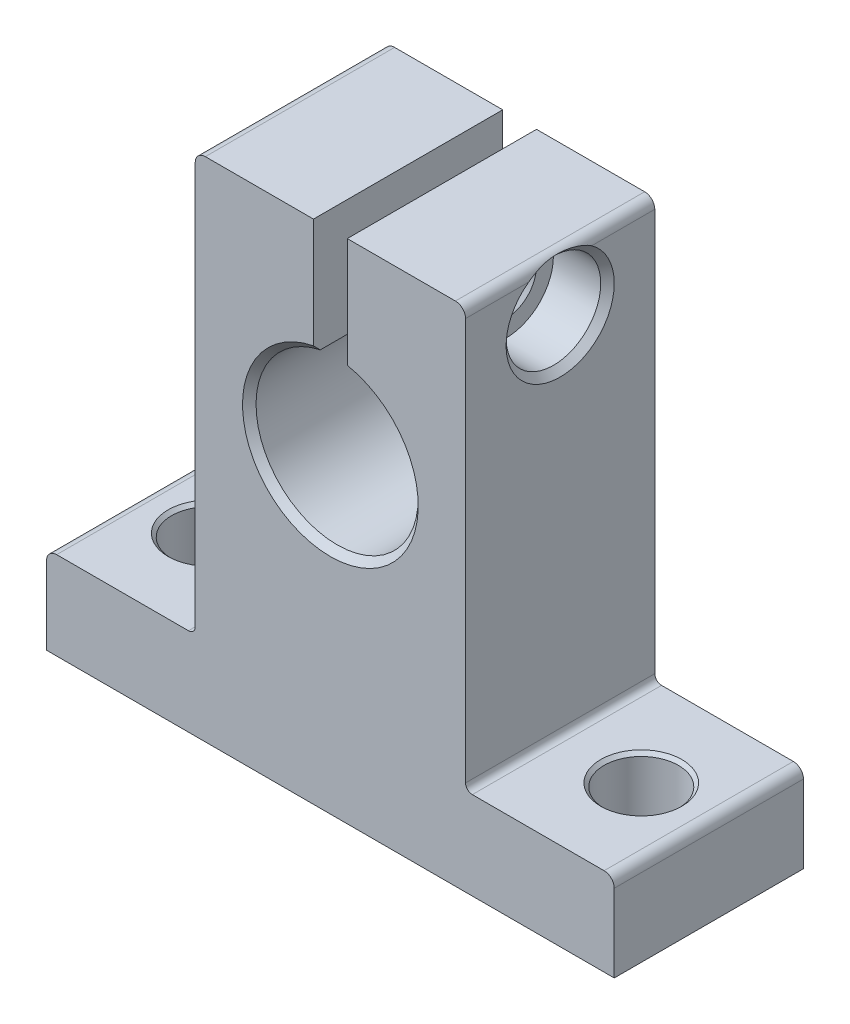
ISO-10303-21;
HEADER;
FILE_DESCRIPTION(('STEP AP214'),'2;1');
FILE_NAME('part.step','',(''),(''),'','','');
FILE_SCHEMA(('AUTOMOTIVE_DESIGN { 1 0 10303 214 1 1 1 1 }'));
ENDSEC;
DATA;
#1=APPLICATION_CONTEXT('core data for automotive mechanical design processes');
#2=APPLICATION_PROTOCOL_DEFINITION('international standard','automotive_design',2000,#1);
#3=PRODUCT_CONTEXT('',#1,'mechanical');
#4=PRODUCT('Part','Part','',(#3));
#5=PRODUCT_RELATED_PRODUCT_CATEGORY('part','',(#4));
#6=PRODUCT_DEFINITION_FORMATION('','',#4);
#7=PRODUCT_DEFINITION_CONTEXT('part definition',#1,'design');
#8=PRODUCT_DEFINITION('design','',#6,#7);
#9=PRODUCT_DEFINITION_SHAPE('','',#8);
#10=(LENGTH_UNIT() NAMED_UNIT(*) SI_UNIT(.MILLI.,.METRE.));
#11=(NAMED_UNIT(*) PLANE_ANGLE_UNIT() SI_UNIT($,.RADIAN.));
#12=(NAMED_UNIT(*) SI_UNIT($,.STERADIAN.) SOLID_ANGLE_UNIT());
#13=UNCERTAINTY_MEASURE_WITH_UNIT(LENGTH_MEASURE(1.E-05),#10,'distance_accuracy_value','');
#14=(GEOMETRIC_REPRESENTATION_CONTEXT(3) GLOBAL_UNCERTAINTY_ASSIGNED_CONTEXT((#13)) GLOBAL_UNIT_ASSIGNED_CONTEXT((#10,
#11,#12)) REPRESENTATION_CONTEXT('',''));
#15=CARTESIAN_POINT('',(0.,0.,0.));
#16=DIRECTION('',(0.,0.,1.));
#17=DIRECTION('',(1.,0.,0.));
#18=AXIS2_PLACEMENT_3D('',#15,#16,#17);
#19=CARTESIAN_POINT('',(-9.99999999999999,14.5,7.));
#20=DIRECTION('',(0.,1.,0.));
#21=DIRECTION('',(0.,0.,1.));
#22=AXIS2_PLACEMENT_3D('',#19,#20,#21);
#23=PLANE('',#22);
#24=DIRECTION('',(1.,0.,0.));
#25=VECTOR('',#24,1.);
#26=CARTESIAN_POINT('',(-9.99999999999999,14.5,-7.));
#27=LINE('',#26,#25);
#28=CARTESIAN_POINT('',(-9.24999999999999,14.5,-7.));
#29=VERTEX_POINT('',#28);
#30=CARTESIAN_POINT('',(-1.25,14.5,-7.));
#31=VERTEX_POINT('',#30);
#32=EDGE_CURVE('E437',#29,#31,#27,.T.);
#33=ORIENTED_EDGE('',*,*,#32,.F.);
#34=DIRECTION('',(0.,0.,-1.));
#35=VECTOR('',#34,1.);
#36=CARTESIAN_POINT('',(-9.24999999999999,14.5,7.));
#37=LINE('',#36,#35);
#38=CARTESIAN_POINT('',(-9.24999999999999,14.5,7.));
#39=VERTEX_POINT('',#38);
#40=EDGE_CURVE('E245',#29,#39,#37,.F.);
#41=ORIENTED_EDGE('',*,*,#40,.T.);
#42=DIRECTION('',(1.,0.,0.));
#43=VECTOR('',#42,1.);
#44=CARTESIAN_POINT('',(-9.99999999999999,14.5,7.));
#45=LINE('',#44,#43);
#46=CARTESIAN_POINT('',(-1.25,14.5,7.));
#47=VERTEX_POINT('',#46);
#48=EDGE_CURVE('E421',#39,#47,#45,.T.);
#49=ORIENTED_EDGE('',*,*,#48,.T.);
#50=DIRECTION('',(0.,0.,-1.));
#51=VECTOR('',#50,1.);
#52=CARTESIAN_POINT('',(-1.25,14.5,7.));
#53=LINE('',#52,#51);
#54=EDGE_CURVE('E426',#47,#31,#53,.T.);
#55=ORIENTED_EDGE('',*,*,#54,.T.);
#56=EDGE_LOOP('',(#33,#41,#49,#55));
#57=FACE_BOUND('',#56,.T.);
#58=ADVANCED_FACE('F41',(#57),#23,.T.);
#59=CARTESIAN_POINT('',(-9.99999999999999,14.5,7.));
#60=DIRECTION('',(1.,0.,0.));
#61=DIRECTION('',(0.,1.,0.));
#62=AXIS2_PLACEMENT_3D('',#59,#60,#61);
#63=PLANE('',#62);
#64=CARTESIAN_POINT('',(-9.99999999999999,10.5,0.));
#65=DIRECTION('',(-1.,0.,0.));
#66=DIRECTION('',(0.,0.,1.));
#67=AXIS2_PLACEMENT_3D('',#64,#65,#66);
#68=CIRCLE('',#67,1.45);
#69=CARTESIAN_POINT('',(-9.99999999999999,10.5,1.45));
#70=VERTEX_POINT('',#69);
#71=EDGE_CURVE('E539',#70,#70,#68,.T.);
#72=ORIENTED_EDGE('',*,*,#71,.F.);
#73=EDGE_LOOP('',(#72));
#74=FACE_BOUND('',#73,.T.);
#75=DIRECTION('',(0.,-1.,0.));
#76=VECTOR('',#75,1.);
#77=CARTESIAN_POINT('',(-9.99999999999999,14.5,-7.));
#78=LINE('',#77,#76);
#79=CARTESIAN_POINT('',(-9.99999999999999,13.75,-7.));
#80=VERTEX_POINT('',#79);
#81=CARTESIAN_POINT('',(-10.,-16.,-7.));
#82=VERTEX_POINT('',#81);
#83=EDGE_CURVE('E466',#80,#82,#78,.T.);
#84=ORIENTED_EDGE('',*,*,#83,.T.);
#85=DIRECTION('',(0.,0.,-1.));
#86=VECTOR('',#85,1.);
#87=CARTESIAN_POINT('',(-10.,-16.,7.));
#88=LINE('',#87,#86);
#89=CARTESIAN_POINT('',(-10.,-16.,7.));
#90=VERTEX_POINT('',#89);
#91=EDGE_CURVE('E211',#82,#90,#88,.F.);
#92=ORIENTED_EDGE('',*,*,#91,.T.);
#93=DIRECTION('',(0.,-1.,0.));
#94=VECTOR('',#93,1.);
#95=CARTESIAN_POINT('',(-9.99999999999999,14.5,7.));
#96=LINE('',#95,#94);
#97=CARTESIAN_POINT('',(-9.99999999999999,13.75,7.));
#98=VERTEX_POINT('',#97);
#99=EDGE_CURVE('E419',#98,#90,#96,.T.);
#100=ORIENTED_EDGE('',*,*,#99,.F.);
#101=DIRECTION('',(0.,0.,-1.));
#102=VECTOR('',#101,1.);
#103=CARTESIAN_POINT('',(-9.99999999999999,13.75,-7.));
#104=LINE('',#103,#102);
#105=EDGE_CURVE('E214',#98,#80,#104,.T.);
#106=ORIENTED_EDGE('',*,*,#105,.T.);
#107=EDGE_LOOP('',(#84,#92,#100,#106));
#108=FACE_BOUND('',#107,.T.);
#109=ADVANCED_FACE('F322',(#74,#108),#63,.F.);
#110=CARTESIAN_POINT('',(-21.,-16.5,7.));
#111=DIRECTION('',(0.,1.,0.));
#112=DIRECTION('',(0.,0.,1.));
#113=AXIS2_PLACEMENT_3D('',#110,#111,#112);
#114=PLANE('',#113);
#115=CARTESIAN_POINT('',(-16.,-16.5,0.));
#116=DIRECTION('',(0.,1.,0.));
#117=DIRECTION('',(0.,0.,1.));
#118=AXIS2_PLACEMENT_3D('',#115,#116,#117);
#119=CIRCLE('',#118,3.);
#120=CARTESIAN_POINT('',(-16.,-16.5,3.));
#121=VERTEX_POINT('',#120);
#122=EDGE_CURVE('E530',#121,#121,#119,.T.);
#123=ORIENTED_EDGE('',*,*,#122,.F.);
#124=EDGE_LOOP('',(#123));
#125=FACE_BOUND('',#124,.T.);
#126=DIRECTION('',(1.,0.,0.));
#127=VECTOR('',#126,1.);
#128=CARTESIAN_POINT('',(-21.,-16.5,7.));
#129=LINE('',#128,#127);
#130=CARTESIAN_POINT('',(-20.25,-16.5,7.));
#131=VERTEX_POINT('',#130);
#132=CARTESIAN_POINT('',(-10.5,-16.5,7.));
#133=VERTEX_POINT('',#132);
#134=EDGE_CURVE('E427',#131,#133,#129,.T.);
#135=ORIENTED_EDGE('',*,*,#134,.T.);
#136=DIRECTION('',(0.,0.,-1.));
#137=VECTOR('',#136,1.);
#138=CARTESIAN_POINT('',(-10.5,-16.5,7.));
#139=LINE('',#138,#137);
#140=CARTESIAN_POINT('',(-10.5,-16.5,-7.));
#141=VERTEX_POINT('',#140);
#142=EDGE_CURVE('E480',#133,#141,#139,.T.);
#143=ORIENTED_EDGE('',*,*,#142,.T.);
#144=DIRECTION('',(1.,0.,0.));
#145=VECTOR('',#144,1.);
#146=CARTESIAN_POINT('',(-21.,-16.5,-7.));
#147=LINE('',#146,#145);
#148=CARTESIAN_POINT('',(-20.25,-16.5,-7.));
#149=VERTEX_POINT('',#148);
#150=EDGE_CURVE('E463',#149,#141,#147,.T.);
#151=ORIENTED_EDGE('',*,*,#150,.F.);
#152=DIRECTION('',(0.,0.,-1.));
#153=VECTOR('',#152,1.);
#154=CARTESIAN_POINT('',(-20.25,-16.5,7.));
#155=LINE('',#154,#153);
#156=EDGE_CURVE('E470',#149,#131,#155,.F.);
#157=ORIENTED_EDGE('',*,*,#156,.T.);
#158=EDGE_LOOP('',(#135,#143,#151,#157));
#159=FACE_BOUND('',#158,.T.);
#160=ADVANCED_FACE('F325',(#125,#159),#114,.T.);
#161=CARTESIAN_POINT('',(-21.,-23.,7.));
#162=DIRECTION('',(-1.,0.,0.));
#163=DIRECTION('',(0.,-1.,0.));
#164=AXIS2_PLACEMENT_3D('',#161,#162,#163);
#165=PLANE('',#164);
#166=DIRECTION('',(0.,1.,0.));
#167=VECTOR('',#166,1.);
#168=CARTESIAN_POINT('',(-21.,-23.,7.));
#169=LINE('',#168,#167);
#170=CARTESIAN_POINT('',(-21.,-23.,7.));
#171=VERTEX_POINT('',#170);
#172=CARTESIAN_POINT('',(-21.,-17.25,7.));
#173=VERTEX_POINT('',#172);
#174=EDGE_CURVE('E433',#171,#173,#169,.T.);
#175=ORIENTED_EDGE('',*,*,#174,.T.);
#176=DIRECTION('',(0.,0.,-1.));
#177=VECTOR('',#176,1.);
#178=CARTESIAN_POINT('',(-21.,-17.25,7.));
#179=LINE('',#178,#177);
#180=CARTESIAN_POINT('',(-21.,-17.25,-7.));
#181=VERTEX_POINT('',#180);
#182=EDGE_CURVE('E225',#173,#181,#179,.T.);
#183=ORIENTED_EDGE('',*,*,#182,.T.);
#184=DIRECTION('',(0.,1.,0.));
#185=VECTOR('',#184,1.);
#186=CARTESIAN_POINT('',(-21.,-23.,-7.));
#187=LINE('',#186,#185);
#188=CARTESIAN_POINT('',(-21.,-23.,-7.));
#189=VERTEX_POINT('',#188);
#190=EDGE_CURVE('E460',#189,#181,#187,.T.);
#191=ORIENTED_EDGE('',*,*,#190,.F.);
#192=DIRECTION('',(0.,0.,-1.));
#193=VECTOR('',#192,1.);
#194=CARTESIAN_POINT('',(-21.,-23.,7.));
#195=LINE('',#194,#193);
#196=EDGE_CURVE('E468',#171,#189,#195,.T.);
#197=ORIENTED_EDGE('',*,*,#196,.F.);
#198=EDGE_LOOP('',(#175,#183,#191,#197));
#199=FACE_BOUND('',#198,.T.);
#200=ADVANCED_FACE('F329',(#199),#165,.T.);
#201=CARTESIAN_POINT('',(-21.,-23.,7.));
#202=DIRECTION('',(0.,1.,0.));
#203=DIRECTION('',(-1.,0.,0.));
#204=AXIS2_PLACEMENT_3D('',#201,#202,#203);
#205=PLANE('',#204);
#206=CARTESIAN_POINT('',(-16.,-23.,0.));
#207=DIRECTION('',(0.,1.,0.));
#208=DIRECTION('',(0.,0.,1.));
#209=AXIS2_PLACEMENT_3D('',#206,#207,#208);
#210=CIRCLE('',#209,3.);
#211=CARTESIAN_POINT('',(-16.,-23.,3.));
#212=VERTEX_POINT('',#211);
#213=EDGE_CURVE('E533',#212,#212,#210,.T.);
#214=ORIENTED_EDGE('',*,*,#213,.T.);
#215=EDGE_LOOP('',(#214));
#216=FACE_BOUND('',#215,.T.);
#217=CARTESIAN_POINT('',(16.,-23.,0.));
#218=DIRECTION('',(0.,1.,0.));
#219=DIRECTION('',(0.,0.,1.));
#220=AXIS2_PLACEMENT_3D('',#217,#218,#219);
#221=CIRCLE('',#220,3.);
#222=CARTESIAN_POINT('',(16.,-23.,3.));
#223=VERTEX_POINT('',#222);
#224=EDGE_CURVE('E521',#223,#223,#221,.T.);
#225=ORIENTED_EDGE('',*,*,#224,.T.);
#226=EDGE_LOOP('',(#225));
#227=FACE_BOUND('',#226,.T.);
#228=DIRECTION('',(1.,0.,0.));
#229=VECTOR('',#228,1.);
#230=CARTESIAN_POINT('',(-21.,-23.,-7.));
#231=LINE('',#230,#229);
#232=CARTESIAN_POINT('',(21.,-23.,-7.));
#233=VERTEX_POINT('',#232);
#234=EDGE_CURVE('E458',#189,#233,#231,.T.);
#235=ORIENTED_EDGE('',*,*,#234,.T.);
#236=DIRECTION('',(0.,0.,-1.));
#237=VECTOR('',#236,1.);
#238=CARTESIAN_POINT('',(21.,-23.,7.));
#239=LINE('',#238,#237);
#240=CARTESIAN_POINT('',(21.,-23.,7.));
#241=VERTEX_POINT('',#240);
#242=EDGE_CURVE('E471',#241,#233,#239,.T.);
#243=ORIENTED_EDGE('',*,*,#242,.F.);
#244=DIRECTION('',(1.,0.,0.));
#245=VECTOR('',#244,1.);
#246=CARTESIAN_POINT('',(-21.,-23.,7.));
#247=LINE('',#246,#245);
#248=EDGE_CURVE('E494',#171,#241,#247,.T.);
#249=ORIENTED_EDGE('',*,*,#248,.F.);
#250=ORIENTED_EDGE('',*,*,#196,.T.);
#251=EDGE_LOOP('',(#235,#243,#249,#250));
#252=FACE_BOUND('',#251,.T.);
#253=ADVANCED_FACE('F333',(#216,#227,#252),#205,.F.);
#254=CARTESIAN_POINT('',(21.,-23.,7.));
#255=DIRECTION('',(-1.,0.,0.));
#256=DIRECTION('',(0.,-1.,0.));
#257=AXIS2_PLACEMENT_3D('',#254,#255,#256);
#258=PLANE('',#257);
#259=DIRECTION('',(0.,1.,0.));
#260=VECTOR('',#259,1.);
#261=CARTESIAN_POINT('',(21.,-23.,-7.));
#262=LINE('',#261,#260);
#263=CARTESIAN_POINT('',(21.,-17.25,-7.));
#264=VERTEX_POINT('',#263);
#265=EDGE_CURVE('E455',#233,#264,#262,.T.);
#266=ORIENTED_EDGE('',*,*,#265,.T.);
#267=DIRECTION('',(0.,0.,-1.));
#268=VECTOR('',#267,1.);
#269=CARTESIAN_POINT('',(21.,-17.25,7.));
#270=LINE('',#269,#268);
#271=CARTESIAN_POINT('',(21.,-17.25,7.));
#272=VERTEX_POINT('',#271);
#273=EDGE_CURVE('E243',#264,#272,#270,.F.);
#274=ORIENTED_EDGE('',*,*,#273,.T.);
#275=DIRECTION('',(0.,1.,0.));
#276=VECTOR('',#275,1.);
#277=CARTESIAN_POINT('',(21.,-23.,7.));
#278=LINE('',#277,#276);
#279=EDGE_CURVE('E495',#241,#272,#278,.T.);
#280=ORIENTED_EDGE('',*,*,#279,.F.);
#281=ORIENTED_EDGE('',*,*,#242,.T.);
#282=EDGE_LOOP('',(#266,#274,#280,#281));
#283=FACE_BOUND('',#282,.T.);
#284=ADVANCED_FACE('F337',(#283),#258,.F.);
#285=CARTESIAN_POINT('',(10.,-16.5,7.));
#286=DIRECTION('',(0.,1.,0.));
#287=DIRECTION('',(0.,0.,1.));
#288=AXIS2_PLACEMENT_3D('',#285,#286,#287);
#289=PLANE('',#288);
#290=CARTESIAN_POINT('',(16.,-16.5,0.));
#291=DIRECTION('',(0.,1.,0.));
#292=DIRECTION('',(0.,0.,1.));
#293=AXIS2_PLACEMENT_3D('',#290,#291,#292);
#294=CIRCLE('',#293,3.);
#295=CARTESIAN_POINT('',(16.,-16.5,3.));
#296=VERTEX_POINT('',#295);
#297=EDGE_CURVE('E518',#296,#296,#294,.T.);
#298=ORIENTED_EDGE('',*,*,#297,.F.);
#299=EDGE_LOOP('',(#298));
#300=FACE_BOUND('',#299,.T.);
#301=DIRECTION('',(1.,0.,0.));
#302=VECTOR('',#301,1.);
#303=CARTESIAN_POINT('',(10.,-16.5,-7.));
#304=LINE('',#303,#302);
#305=CARTESIAN_POINT('',(10.5,-16.5,-7.));
#306=VERTEX_POINT('',#305);
#307=CARTESIAN_POINT('',(20.25,-16.5,-7.));
#308=VERTEX_POINT('',#307);
#309=EDGE_CURVE('E452',#306,#308,#304,.T.);
#310=ORIENTED_EDGE('',*,*,#309,.F.);
#311=DIRECTION('',(0.,0.,-1.));
#312=VECTOR('',#311,1.);
#313=CARTESIAN_POINT('',(10.5,-16.5,7.));
#314=LINE('',#313,#312);
#315=CARTESIAN_POINT('',(10.5,-16.5,7.));
#316=VERTEX_POINT('',#315);
#317=EDGE_CURVE('E223',#306,#316,#314,.F.);
#318=ORIENTED_EDGE('',*,*,#317,.T.);
#319=DIRECTION('',(1.,0.,0.));
#320=VECTOR('',#319,1.);
#321=CARTESIAN_POINT('',(10.,-16.5,7.));
#322=LINE('',#321,#320);
#323=CARTESIAN_POINT('',(20.25,-16.5,7.));
#324=VERTEX_POINT('',#323);
#325=EDGE_CURVE('E500',#316,#324,#322,.T.);
#326=ORIENTED_EDGE('',*,*,#325,.T.);
#327=DIRECTION('',(0.,0.,-1.));
#328=VECTOR('',#327,1.);
#329=CARTESIAN_POINT('',(20.25,-16.5,-7.));
#330=LINE('',#329,#328);
#331=EDGE_CURVE('E220',#324,#308,#330,.T.);
#332=ORIENTED_EDGE('',*,*,#331,.T.);
#333=EDGE_LOOP('',(#310,#318,#326,#332));
#334=FACE_BOUND('',#333,.T.);
#335=ADVANCED_FACE('F341',(#300,#334),#289,.T.);
#336=CARTESIAN_POINT('',(9.99999999999999,14.5,7.));
#337=DIRECTION('',(1.,0.,0.));
#338=DIRECTION('',(0.,1.,0.));
#339=AXIS2_PLACEMENT_3D('',#336,#337,#338);
#340=PLANE('',#339);
#341=CARTESIAN_POINT('',(10.,10.5,0.));
#342=DIRECTION('',(1.,0.,0.));
#343=DIRECTION('',(0.,0.,-1.));
#344=AXIS2_PLACEMENT_3D('',#341,#342,#343);
#345=CIRCLE('',#344,4.);
#346=CARTESIAN_POINT('',(10.,13.75,2.33184476327221));
#347=VERTEX_POINT('',#346);
#348=CARTESIAN_POINT('',(9.99999999999999,13.75,-2.3318447632722));
#349=VERTEX_POINT('',#348);
#350=EDGE_CURVE('E190',#347,#349,#345,.T.);
#351=ORIENTED_EDGE('',*,*,#350,.F.);
#352=DIRECTION('',(0.,0.,-1.));
#353=VECTOR('',#352,1.);
#354=CARTESIAN_POINT('',(9.99999999999999,13.75,7.));
#355=LINE('',#354,#353);
#356=CARTESIAN_POINT('',(9.99999999999999,13.75,7.));
#357=VERTEX_POINT('',#356);
#358=EDGE_CURVE('E201',#347,#357,#355,.F.);
#359=ORIENTED_EDGE('',*,*,#358,.T.);
#360=DIRECTION('',(0.,-1.,0.));
#361=VECTOR('',#360,1.);
#362=CARTESIAN_POINT('',(9.99999999999999,14.5,7.));
#363=LINE('',#362,#361);
#364=CARTESIAN_POINT('',(10.,-16.,7.));
#365=VERTEX_POINT('',#364);
#366=EDGE_CURVE('E503',#357,#365,#363,.T.);
#367=ORIENTED_EDGE('',*,*,#366,.T.);
#368=DIRECTION('',(0.,0.,-1.));
#369=VECTOR('',#368,1.);
#370=CARTESIAN_POINT('',(10.,-16.,-7.));
#371=LINE('',#370,#369);
#372=CARTESIAN_POINT('',(10.,-16.,-7.));
#373=VERTEX_POINT('',#372);
#374=EDGE_CURVE('E213',#365,#373,#371,.T.);
#375=ORIENTED_EDGE('',*,*,#374,.T.);
#376=DIRECTION('',(0.,-1.,0.));
#377=VECTOR('',#376,1.);
#378=CARTESIAN_POINT('',(9.99999999999999,14.5,-7.));
#379=LINE('',#378,#377);
#380=CARTESIAN_POINT('',(9.99999999999999,13.75,-7.));
#381=VERTEX_POINT('',#380);
#382=EDGE_CURVE('E449',#381,#373,#379,.T.);
#383=ORIENTED_EDGE('',*,*,#382,.F.);
#384=EDGE_CURVE('E204',#381,#349,#355,.F.);
#385=ORIENTED_EDGE('',*,*,#384,.T.);
#386=EDGE_LOOP('',(#351,#359,#367,#375,#383,#385));
#387=FACE_BOUND('',#386,.T.);
#388=ADVANCED_FACE('F199',(#387),#340,.T.);
#389=CARTESIAN_POINT('',(1.25,14.5,7.));
#390=DIRECTION('',(0.,1.,0.));
#391=DIRECTION('',(-1.,0.,0.));
#392=AXIS2_PLACEMENT_3D('',#389,#390,#391);
#393=PLANE('',#392);
#394=DIRECTION('',(1.,0.,0.));
#395=VECTOR('',#394,1.);
#396=CARTESIAN_POINT('',(1.25,14.5,7.));
#397=LINE('',#396,#395);
#398=CARTESIAN_POINT('',(1.25,14.5,7.));
#399=VERTEX_POINT('',#398);
#400=CARTESIAN_POINT('',(9.24999999999999,14.5,7.));
#401=VERTEX_POINT('',#400);
#402=EDGE_CURVE('E505',#399,#401,#397,.T.);
#403=ORIENTED_EDGE('',*,*,#402,.T.);
#404=DIRECTION('',(0.,0.,-1.));
#405=VECTOR('',#404,1.);
#406=CARTESIAN_POINT('',(9.24999999999999,14.5,7.));
#407=LINE('',#406,#405);
#408=CARTESIAN_POINT('',(9.24999999999999,14.5,-7.));
#409=VERTEX_POINT('',#408);
#410=EDGE_CURVE('E247',#401,#409,#407,.T.);
#411=ORIENTED_EDGE('',*,*,#410,.T.);
#412=DIRECTION('',(1.,0.,0.));
#413=VECTOR('',#412,1.);
#414=CARTESIAN_POINT('',(1.25,14.5,-7.));
#415=LINE('',#414,#413);
#416=CARTESIAN_POINT('',(1.25,14.5,-7.));
#417=VERTEX_POINT('',#416);
#418=EDGE_CURVE('E446',#417,#409,#415,.T.);
#419=ORIENTED_EDGE('',*,*,#418,.F.);
#420=DIRECTION('',(0.,0.,-1.));
#421=VECTOR('',#420,1.);
#422=CARTESIAN_POINT('',(1.25,14.5,7.));
#423=LINE('',#422,#421);
#424=EDGE_CURVE('E474',#399,#417,#423,.T.);
#425=ORIENTED_EDGE('',*,*,#424,.F.);
#426=EDGE_LOOP('',(#403,#411,#419,#425));
#427=FACE_BOUND('',#426,.T.);
#428=ADVANCED_FACE('F348',(#427),#393,.T.);
#429=CARTESIAN_POINT('',(1.25,14.5,7.));
#430=DIRECTION('',(1.,0.,0.));
#431=DIRECTION('',(0.,1.,0.));
#432=AXIS2_PLACEMENT_3D('',#429,#430,#431);
#433=PLANE('',#432);
#434=CARTESIAN_POINT('',(1.25,10.5,0.));
#435=DIRECTION('',(1.,0.,0.));
#436=DIRECTION('',(0.,1.,0.));
#437=AXIS2_PLACEMENT_3D('',#434,#435,#436);
#438=CIRCLE('',#437,2.);
#439=CARTESIAN_POINT('',(1.25,12.5,0.));
#440=VERTEX_POINT('',#439);
#441=EDGE_CURVE('E542',#440,#440,#438,.T.);
#442=ORIENTED_EDGE('',*,*,#441,.T.);
#443=EDGE_LOOP('',(#442));
#444=FACE_BOUND('',#443,.T.);
#445=DIRECTION('',(0.,-1.,0.));
#446=VECTOR('',#445,1.);
#447=CARTESIAN_POINT('',(1.25,14.5,-7.));
#448=LINE('',#447,#446);
#449=CARTESIAN_POINT('',(1.25,6.37867541108654,-7.));
#450=VERTEX_POINT('',#449);
#451=EDGE_CURVE('E443',#417,#450,#448,.T.);
#452=ORIENTED_EDGE('',*,*,#451,.T.);
#453=CARTESIAN_POINT('',(1.25,6.37867541108654,-7.));
#454=CARTESIAN_POINT('',(1.25,6.29369027673478,-6.91659567988044));
#455=CARTESIAN_POINT('',(1.25,6.20867036702757,-6.83322685344399));
#456=CARTESIAN_POINT('',(1.25,6.03856099571727,-6.66656018677634));
#457=CARTESIAN_POINT('',(1.25,5.95347153411322,-6.58326234654612));
#458=CARTESIAN_POINT('',(1.25,5.86834729715275,-6.5));
#459=B_SPLINE_CURVE_WITH_KNOTS('',3,(#453,#454,#455,#456,#457,#458),.UNSPECIFIED.,.F.,.F.,(4,2,
4),(0.,0.357223622416151,0.714447249809102),.UNSPECIFIED.);
#460=CARTESIAN_POINT('',(1.25,5.86834729715275,-6.5));
#461=VERTEX_POINT('',#460);
#462=EDGE_CURVE('E365',#450,#461,#459,.T.);
#463=ORIENTED_EDGE('',*,*,#462,.T.);
#464=DIRECTION('',(0.,0.,-1.));
#465=VECTOR('',#464,1.);
#466=CARTESIAN_POINT('',(1.25,5.86834729715275,7.));
#467=LINE('',#466,#465);
#468=CARTESIAN_POINT('',(1.25,5.86834729715275,6.5));
#469=VERTEX_POINT('',#468);
#470=EDGE_CURVE('E476',#469,#461,#467,.T.);
#471=ORIENTED_EDGE('',*,*,#470,.F.);
#472=CARTESIAN_POINT('',(1.25,5.86834729715275,6.5));
#473=CARTESIAN_POINT('',(1.25,5.95347153411322,6.58326234654612));
#474=CARTESIAN_POINT('',(1.25,6.03856099571727,6.66656018677634));
#475=CARTESIAN_POINT('',(1.25,6.20867036702756,6.83322685344399));
#476=CARTESIAN_POINT('',(1.25,6.29369027673477,6.91659567988044));
#477=CARTESIAN_POINT('',(1.25,6.37867541108653,7.));
#478=B_SPLINE_CURVE_WITH_KNOTS('',3,(#472,#473,#474,#475,#476,#477),.UNSPECIFIED.,.F.,.F.,(4,2,
4),(0.,0.357223627392948,0.714447249809097),.UNSPECIFIED.);
#479=CARTESIAN_POINT('',(1.25,6.37867541108654,7.));
#480=VERTEX_POINT('',#479);
#481=EDGE_CURVE('E360',#469,#480,#478,.T.);
#482=ORIENTED_EDGE('',*,*,#481,.T.);
#483=DIRECTION('',(0.,-1.,0.));
#484=VECTOR('',#483,1.);
#485=CARTESIAN_POINT('',(1.25,14.5,7.));
#486=LINE('',#485,#484);
#487=EDGE_CURVE('E508',#399,#480,#486,.T.);
#488=ORIENTED_EDGE('',*,*,#487,.F.);
#489=ORIENTED_EDGE('',*,*,#424,.T.);
#490=EDGE_LOOP('',(#452,#463,#471,#482,#488,#489));
#491=FACE_BOUND('',#490,.T.);
#492=ADVANCED_FACE('F351',(#444,#491),#433,.F.);
#493=CARTESIAN_POINT('',(0.,0.,7.));
#494=DIRECTION('',(0.,0.,-1.));
#495=DIRECTION('',(-1.,0.,0.));
#496=AXIS2_PLACEMENT_3D('',#493,#494,#495);
#497=CYLINDRICAL_SURFACE('',#496,6.);
#498=ORIENTED_EDGE('',*,*,#470,.T.);
#499=CARTESIAN_POINT('',(0.,0.,-6.5));
#500=DIRECTION('',(0.,0.,1.));
#501=DIRECTION('',(1.,0.,0.));
#502=AXIS2_PLACEMENT_3D('',#499,#500,#501);
#503=CIRCLE('',#502,6.);
#504=CARTESIAN_POINT('',(-1.25,5.86834729715275,-6.5));
#505=VERTEX_POINT('',#504);
#506=EDGE_CURVE('E63',#461,#505,#503,.F.);
#507=ORIENTED_EDGE('',*,*,#506,.T.);
#508=DIRECTION('',(0.,0.,-1.));
#509=VECTOR('',#508,1.);
#510=CARTESIAN_POINT('',(-1.25,5.86834729715275,7.));
#511=LINE('',#510,#509);
#512=CARTESIAN_POINT('',(-1.25,5.86834729715275,6.5));
#513=VERTEX_POINT('',#512);
#514=EDGE_CURVE('E430',#513,#505,#511,.T.);
#515=ORIENTED_EDGE('',*,*,#514,.F.);
#516=CARTESIAN_POINT('',(0.,0.,6.5));
#517=DIRECTION('',(0.,0.,1.));
#518=DIRECTION('',(1.,0.,0.));
#519=AXIS2_PLACEMENT_3D('',#516,#517,#518);
#520=CIRCLE('',#519,6.);
#521=EDGE_CURVE('E370',#513,#469,#520,.T.);
#522=ORIENTED_EDGE('',*,*,#521,.T.);
#523=EDGE_LOOP('',(#498,#507,#515,#522));
#524=FACE_BOUND('',#523,.T.);
#525=ADVANCED_FACE('F356',(#524),#497,.F.);
#526=CARTESIAN_POINT('',(-1.25,14.5,7.));
#527=DIRECTION('',(1.,0.,0.));
#528=DIRECTION('',(0.,1.,0.));
#529=AXIS2_PLACEMENT_3D('',#526,#527,#528);
#530=PLANE('',#529);
#531=CARTESIAN_POINT('',(-1.25,10.5,0.));
#532=DIRECTION('',(1.,0.,0.));
#533=DIRECTION('',(0.,1.,0.));
#534=AXIS2_PLACEMENT_3D('',#531,#532,#533);
#535=CIRCLE('',#534,1.45);
#536=CARTESIAN_POINT('',(-1.25,11.95,0.));
#537=VERTEX_POINT('',#536);
#538=EDGE_CURVE('E536',#537,#537,#535,.T.);
#539=ORIENTED_EDGE('',*,*,#538,.F.);
#540=EDGE_LOOP('',(#539));
#541=FACE_BOUND('',#540,.T.);
#542=ORIENTED_EDGE('',*,*,#514,.T.);
#543=CARTESIAN_POINT('',(-1.25,5.86834729715275,-6.5));
#544=CARTESIAN_POINT('',(-1.25,5.95347153411322,-6.58326234654612));
#545=CARTESIAN_POINT('',(-1.25,6.03856099571727,-6.66656018677634));
#546=CARTESIAN_POINT('',(-1.25,6.20867036702757,-6.83322685344399));
#547=CARTESIAN_POINT('',(-1.25,6.29369027673478,-6.91659567988044));
#548=CARTESIAN_POINT('',(-1.25,6.37867541108654,-7.));
#549=B_SPLINE_CURVE_WITH_KNOTS('',3,(#543,#544,#545,#546,#547,#548),.UNSPECIFIED.,.F.,.F.,(4,2,
4),(0.,0.357223627392951,0.714447249809102),.UNSPECIFIED.);
#550=CARTESIAN_POINT('',(-1.25,6.37867541108654,-7.));
#551=VERTEX_POINT('',#550);
#552=EDGE_CURVE('E50',#505,#551,#549,.T.);
#553=ORIENTED_EDGE('',*,*,#552,.T.);
#554=DIRECTION('',(0.,-1.,0.));
#555=VECTOR('',#554,1.);
#556=CARTESIAN_POINT('',(-1.25,14.5,-7.));
#557=LINE('',#556,#555);
#558=EDGE_CURVE('E439',#31,#551,#557,.T.);
#559=ORIENTED_EDGE('',*,*,#558,.F.);
#560=ORIENTED_EDGE('',*,*,#54,.F.);
#561=DIRECTION('',(0.,-1.,0.));
#562=VECTOR('',#561,1.);
#563=CARTESIAN_POINT('',(-1.25,14.5,7.));
#564=LINE('',#563,#562);
#565=CARTESIAN_POINT('',(-1.25,6.37867541108654,7.));
#566=VERTEX_POINT('',#565);
#567=EDGE_CURVE('E510',#47,#566,#564,.T.);
#568=ORIENTED_EDGE('',*,*,#567,.T.);
#569=CARTESIAN_POINT('',(-1.25,6.37867541108654,7.));
#570=CARTESIAN_POINT('',(-1.25,6.29369027673477,6.91659567988044));
#571=CARTESIAN_POINT('',(-1.25,6.20867036702756,6.83322685344399));
#572=CARTESIAN_POINT('',(-1.25,6.03856099571727,6.66656018677634));
#573=CARTESIAN_POINT('',(-1.25,5.95347153411322,6.58326234654612));
#574=CARTESIAN_POINT('',(-1.25,5.86834729715275,6.5));
#575=B_SPLINE_CURVE_WITH_KNOTS('',3,(#569,#570,#571,#572,#573,#574),.UNSPECIFIED.,.F.,.F.,(4,2,
4),(0.,0.357223622416148,0.714447249809096),.UNSPECIFIED.);
#576=EDGE_CURVE('E380',#566,#513,#575,.T.);
#577=ORIENTED_EDGE('',*,*,#576,.T.);
#578=EDGE_LOOP('',(#542,#553,#559,#560,#568,#577));
#579=FACE_BOUND('',#578,.T.);
#580=ADVANCED_FACE('F318',(#541,#579),#530,.T.);
#581=CARTESIAN_POINT('',(0.,0.,7.));
#582=DIRECTION('',(0.,0.,1.));
#583=DIRECTION('',(1.,0.,0.));
#584=AXIS2_PLACEMENT_3D('',#581,#582,#583);
#585=PLANE('',#584);
#586=ORIENTED_EDGE('',*,*,#487,.T.);
#587=CARTESIAN_POINT('',(0.,0.,7.));
#588=DIRECTION('',(0.,0.,1.));
#589=DIRECTION('',(1.,0.,0.));
#590=AXIS2_PLACEMENT_3D('',#587,#588,#589);
#591=CIRCLE('',#590,6.5);
#592=EDGE_CURVE('E12',#480,#566,#591,.F.);
#593=ORIENTED_EDGE('',*,*,#592,.T.);
#594=ORIENTED_EDGE('',*,*,#567,.F.);
#595=ORIENTED_EDGE('',*,*,#48,.F.);
#596=CARTESIAN_POINT('',(-9.24999999999999,13.75,7.));
#597=DIRECTION('',(0.,0.,1.));
#598=DIRECTION('',(1.,0.,0.));
#599=AXIS2_PLACEMENT_3D('',#596,#597,#598);
#600=CIRCLE('',#599,0.75);
#601=EDGE_CURVE('E237',#39,#98,#600,.T.);
#602=ORIENTED_EDGE('',*,*,#601,.T.);
#603=ORIENTED_EDGE('',*,*,#99,.T.);
#604=CARTESIAN_POINT('',(-10.5,-16.,7.));
#605=DIRECTION('',(0.,0.,1.));
#606=DIRECTION('',(1.,0.,0.));
#607=AXIS2_PLACEMENT_3D('',#604,#605,#606);
#608=CIRCLE('',#607,0.5);
#609=EDGE_CURVE('E252',#90,#133,#608,.F.);
#610=ORIENTED_EDGE('',*,*,#609,.T.);
#611=ORIENTED_EDGE('',*,*,#134,.F.);
#612=CARTESIAN_POINT('',(-20.25,-17.25,7.));
#613=DIRECTION('',(0.,0.,1.));
#614=DIRECTION('',(1.,0.,0.));
#615=AXIS2_PLACEMENT_3D('',#612,#613,#614);
#616=CIRCLE('',#615,0.75);
#617=EDGE_CURVE('E241',#131,#173,#616,.T.);
#618=ORIENTED_EDGE('',*,*,#617,.T.);
#619=ORIENTED_EDGE('',*,*,#174,.F.);
#620=ORIENTED_EDGE('',*,*,#248,.T.);
#621=ORIENTED_EDGE('',*,*,#279,.T.);
#622=CARTESIAN_POINT('',(20.25,-17.25,7.));
#623=DIRECTION('',(0.,0.,1.));
#624=DIRECTION('',(1.,0.,0.));
#625=AXIS2_PLACEMENT_3D('',#622,#623,#624);
#626=CIRCLE('',#625,0.75);
#627=EDGE_CURVE('E239',#272,#324,#626,.T.);
#628=ORIENTED_EDGE('',*,*,#627,.T.);
#629=ORIENTED_EDGE('',*,*,#325,.F.);
#630=CARTESIAN_POINT('',(10.5,-16.,7.));
#631=DIRECTION('',(0.,0.,1.));
#632=DIRECTION('',(1.,0.,0.));
#633=AXIS2_PLACEMENT_3D('',#630,#631,#632);
#634=CIRCLE('',#633,0.5);
#635=EDGE_CURVE('E196',#316,#365,#634,.F.);
#636=ORIENTED_EDGE('',*,*,#635,.T.);
#637=ORIENTED_EDGE('',*,*,#366,.F.);
#638=CARTESIAN_POINT('',(9.24999999999999,13.75,7.));
#639=DIRECTION('',(0.,0.,1.));
#640=DIRECTION('',(1.,0.,0.));
#641=AXIS2_PLACEMENT_3D('',#638,#639,#640);
#642=CIRCLE('',#641,0.75);
#643=EDGE_CURVE('E210',#357,#401,#642,.T.);
#644=ORIENTED_EDGE('',*,*,#643,.T.);
#645=ORIENTED_EDGE('',*,*,#402,.F.);
#646=EDGE_LOOP('',(#586,#593,#594,#595,#602,#603,#610,#611,#618,#619,#620,#621,#628,#629,#636,
#637,#644,#645));
#647=FACE_BOUND('',#646,.T.);
#648=ADVANCED_FACE('F315',(#647),#585,.T.);
#649=CARTESIAN_POINT('',(0.,0.,-7.));
#650=DIRECTION('',(0.,0.,1.));
#651=DIRECTION('',(1.,0.,0.));
#652=AXIS2_PLACEMENT_3D('',#649,#650,#651);
#653=PLANE('',#652);
#654=ORIENTED_EDGE('',*,*,#558,.T.);
#655=CARTESIAN_POINT('',(0.,0.,-7.));
#656=DIRECTION('',(0.,0.,1.));
#657=DIRECTION('',(1.,0.,0.));
#658=AXIS2_PLACEMENT_3D('',#655,#656,#657);
#659=CIRCLE('',#658,6.50000000000001);
#660=EDGE_CURVE('E195',#551,#450,#659,.T.);
#661=ORIENTED_EDGE('',*,*,#660,.T.);
#662=ORIENTED_EDGE('',*,*,#451,.F.);
#663=ORIENTED_EDGE('',*,*,#418,.T.);
#664=CARTESIAN_POINT('',(9.24999999999999,13.75,-7.));
#665=DIRECTION('',(0.,0.,1.));
#666=DIRECTION('',(1.,0.,0.));
#667=AXIS2_PLACEMENT_3D('',#664,#665,#666);
#668=CIRCLE('',#667,0.75);
#669=EDGE_CURVE('E228',#409,#381,#668,.F.);
#670=ORIENTED_EDGE('',*,*,#669,.T.);
#671=ORIENTED_EDGE('',*,*,#382,.T.);
#672=CARTESIAN_POINT('',(10.5,-16.,-7.));
#673=DIRECTION('',(0.,0.,1.));
#674=DIRECTION('',(1.,0.,0.));
#675=AXIS2_PLACEMENT_3D('',#672,#673,#674);
#676=CIRCLE('',#675,0.5);
#677=EDGE_CURVE('E254',#373,#306,#676,.T.);
#678=ORIENTED_EDGE('',*,*,#677,.T.);
#679=ORIENTED_EDGE('',*,*,#309,.T.);
#680=CARTESIAN_POINT('',(20.25,-17.25,-7.));
#681=DIRECTION('',(0.,0.,1.));
#682=DIRECTION('',(1.,0.,0.));
#683=AXIS2_PLACEMENT_3D('',#680,#681,#682);
#684=CIRCLE('',#683,0.75);
#685=EDGE_CURVE('E232',#308,#264,#684,.F.);
#686=ORIENTED_EDGE('',*,*,#685,.T.);
#687=ORIENTED_EDGE('',*,*,#265,.F.);
#688=ORIENTED_EDGE('',*,*,#234,.F.);
#689=ORIENTED_EDGE('',*,*,#190,.T.);
#690=CARTESIAN_POINT('',(-20.25,-17.25,-7.));
#691=DIRECTION('',(0.,0.,1.));
#692=DIRECTION('',(1.,0.,0.));
#693=AXIS2_PLACEMENT_3D('',#690,#691,#692);
#694=CIRCLE('',#693,0.75);
#695=EDGE_CURVE('E234',#181,#149,#694,.F.);
#696=ORIENTED_EDGE('',*,*,#695,.T.);
#697=ORIENTED_EDGE('',*,*,#150,.T.);
#698=CARTESIAN_POINT('',(-10.5,-16.,-7.));
#699=DIRECTION('',(0.,0.,1.));
#700=DIRECTION('',(1.,0.,0.));
#701=AXIS2_PLACEMENT_3D('',#698,#699,#700);
#702=CIRCLE('',#701,0.5);
#703=EDGE_CURVE('E250',#141,#82,#702,.T.);
#704=ORIENTED_EDGE('',*,*,#703,.T.);
#705=ORIENTED_EDGE('',*,*,#83,.F.);
#706=CARTESIAN_POINT('',(-9.24999999999999,13.75,-7.));
#707=DIRECTION('',(0.,0.,1.));
#708=DIRECTION('',(1.,0.,0.));
#709=AXIS2_PLACEMENT_3D('',#706,#707,#708);
#710=CIRCLE('',#709,0.75);
#711=EDGE_CURVE('E230',#80,#29,#710,.F.);
#712=ORIENTED_EDGE('',*,*,#711,.T.);
#713=ORIENTED_EDGE('',*,*,#32,.T.);
#714=EDGE_LOOP('',(#654,#661,#662,#663,#670,#671,#678,#679,#686,#687,#688,#689,#696,#697,#704,
#705,#712,#713));
#715=FACE_BOUND('',#714,.T.);
#716=ADVANCED_FACE('F313',(#715),#653,.F.);
#717=CARTESIAN_POINT('',(16.,-22.75,0.));
#718=DIRECTION('',(0.,-1.,0.));
#719=DIRECTION('',(0.,0.,-1.));
#720=AXIS2_PLACEMENT_3D('',#717,#718,#719);
#721=CONICAL_SURFACE('',#720,2.75,0.785398163397442);
#722=ORIENTED_EDGE('',*,*,#224,.F.);
#723=EDGE_LOOP('',(#722));
#724=FACE_BOUND('',#723,.T.);
#725=CARTESIAN_POINT('',(16.,-22.75,0.));
#726=DIRECTION('',(0.,1.,0.));
#727=DIRECTION('',(0.,0.,1.));
#728=AXIS2_PLACEMENT_3D('',#725,#726,#727);
#729=CIRCLE('',#728,2.75);
#730=CARTESIAN_POINT('',(16.,-22.75,2.75));
#731=VERTEX_POINT('',#730);
#732=EDGE_CURVE('E440',#731,#731,#729,.T.);
#733=ORIENTED_EDGE('',*,*,#732,.T.);
#734=EDGE_LOOP('',(#733));
#735=FACE_BOUND('',#734,.T.);
#736=ADVANCED_FACE('F309',(#724,#735),#721,.F.);
#737=CARTESIAN_POINT('',(16.,-16.5,0.));
#738=DIRECTION('',(0.,1.,0.));
#739=DIRECTION('',(0.,0.,1.));
#740=AXIS2_PLACEMENT_3D('',#737,#738,#739);
#741=CYLINDRICAL_SURFACE('',#740,2.75);
#742=ORIENTED_EDGE('',*,*,#732,.F.);
#743=EDGE_LOOP('',(#742));
#744=FACE_BOUND('',#743,.T.);
#745=CARTESIAN_POINT('',(16.,-16.75,0.));
#746=DIRECTION('',(0.,1.,0.));
#747=DIRECTION('',(0.,0.,1.));
#748=AXIS2_PLACEMENT_3D('',#745,#746,#747);
#749=CIRCLE('',#748,2.75);
#750=CARTESIAN_POINT('',(16.,-16.75,2.75));
#751=VERTEX_POINT('',#750);
#752=EDGE_CURVE('E515',#751,#751,#749,.T.);
#753=ORIENTED_EDGE('',*,*,#752,.T.);
#754=EDGE_LOOP('',(#753));
#755=FACE_BOUND('',#754,.T.);
#756=ADVANCED_FACE('F305',(#744,#755),#741,.F.);
#757=CARTESIAN_POINT('',(16.,-16.5,0.));
#758=DIRECTION('',(0.,1.,0.));
#759=DIRECTION('',(0.,0.,1.));
#760=AXIS2_PLACEMENT_3D('',#757,#758,#759);
#761=CONICAL_SURFACE('',#760,3.,0.785398163397448);
#762=ORIENTED_EDGE('',*,*,#752,.F.);
#763=EDGE_LOOP('',(#762));
#764=FACE_BOUND('',#763,.T.);
#765=ORIENTED_EDGE('',*,*,#297,.T.);
#766=EDGE_LOOP('',(#765));
#767=FACE_BOUND('',#766,.T.);
#768=ADVANCED_FACE('F301',(#764,#767),#761,.F.);
#769=CARTESIAN_POINT('',(-16.,-22.75,0.));
#770=DIRECTION('',(0.,-1.,0.));
#771=DIRECTION('',(0.,0.,-1.));
#772=AXIS2_PLACEMENT_3D('',#769,#770,#771);
#773=CONICAL_SURFACE('',#772,2.75,0.785398163397442);
#774=ORIENTED_EDGE('',*,*,#213,.F.);
#775=EDGE_LOOP('',(#774));
#776=FACE_BOUND('',#775,.T.);
#777=CARTESIAN_POINT('',(-16.,-22.75,0.));
#778=DIRECTION('',(0.,1.,0.));
#779=DIRECTION('',(0.,0.,1.));
#780=AXIS2_PLACEMENT_3D('',#777,#778,#779);
#781=CIRCLE('',#780,2.75);
#782=CARTESIAN_POINT('',(-16.,-22.75,2.75));
#783=VERTEX_POINT('',#782);
#784=EDGE_CURVE('E524',#783,#783,#781,.T.);
#785=ORIENTED_EDGE('',*,*,#784,.T.);
#786=EDGE_LOOP('',(#785));
#787=FACE_BOUND('',#786,.T.);
#788=ADVANCED_FACE('F297',(#776,#787),#773,.F.);
#789=CARTESIAN_POINT('',(-16.,-16.5,0.));
#790=DIRECTION('',(0.,1.,0.));
#791=DIRECTION('',(0.,0.,1.));
#792=AXIS2_PLACEMENT_3D('',#789,#790,#791);
#793=CYLINDRICAL_SURFACE('',#792,2.75);
#794=ORIENTED_EDGE('',*,*,#784,.F.);
#795=EDGE_LOOP('',(#794));
#796=FACE_BOUND('',#795,.T.);
#797=CARTESIAN_POINT('',(-16.,-16.75,0.));
#798=DIRECTION('',(0.,1.,0.));
#799=DIRECTION('',(0.,0.,1.));
#800=AXIS2_PLACEMENT_3D('',#797,#798,#799);
#801=CIRCLE('',#800,2.75);
#802=CARTESIAN_POINT('',(-16.,-16.75,2.75));
#803=VERTEX_POINT('',#802);
#804=EDGE_CURVE('E527',#803,#803,#801,.T.);
#805=ORIENTED_EDGE('',*,*,#804,.T.);
#806=EDGE_LOOP('',(#805));
#807=FACE_BOUND('',#806,.T.);
#808=ADVANCED_FACE('F293',(#796,#807),#793,.F.);
#809=CARTESIAN_POINT('',(-16.,-16.5,0.));
#810=DIRECTION('',(0.,1.,0.));
#811=DIRECTION('',(0.,0.,1.));
#812=AXIS2_PLACEMENT_3D('',#809,#810,#811);
#813=CONICAL_SURFACE('',#812,3.,0.785398163397448);
#814=ORIENTED_EDGE('',*,*,#804,.F.);
#815=EDGE_LOOP('',(#814));
#816=FACE_BOUND('',#815,.T.);
#817=ORIENTED_EDGE('',*,*,#122,.T.);
#818=EDGE_LOOP('',(#817));
#819=FACE_BOUND('',#818,.T.);
#820=ADVANCED_FACE('F289',(#816,#819),#813,.F.);
#821=CARTESIAN_POINT('',(-9.99999999999999,10.5,0.));
#822=DIRECTION('',(-1.,0.,0.));
#823=DIRECTION('',(0.,0.,1.));
#824=AXIS2_PLACEMENT_3D('',#821,#822,#823);
#825=CYLINDRICAL_SURFACE('',#824,1.45);
#826=ORIENTED_EDGE('',*,*,#71,.T.);
#827=EDGE_LOOP('',(#826));
#828=FACE_BOUND('',#827,.T.);
#829=ORIENTED_EDGE('',*,*,#538,.T.);
#830=EDGE_LOOP('',(#829));
#831=FACE_BOUND('',#830,.T.);
#832=ADVANCED_FACE('F285',(#828,#831),#825,.F.);
#833=CARTESIAN_POINT('',(-10.5,-16.,7.));
#834=DIRECTION('',(0.,0.,-1.));
#835=DIRECTION('',(-1.,0.,0.));
#836=AXIS2_PLACEMENT_3D('',#833,#834,#835);
#837=CYLINDRICAL_SURFACE('',#836,0.5);
#838=ORIENTED_EDGE('',*,*,#609,.F.);
#839=ORIENTED_EDGE('',*,*,#91,.F.);
#840=ORIENTED_EDGE('',*,*,#703,.F.);
#841=ORIENTED_EDGE('',*,*,#142,.F.);
#842=EDGE_LOOP('',(#838,#839,#840,#841));
#843=FACE_BOUND('',#842,.T.);
#844=ADVANCED_FACE('F288',(#843),#837,.F.);
#845=CARTESIAN_POINT('',(10.5,-16.,7.));
#846=DIRECTION('',(0.,0.,1.));
#847=DIRECTION('',(1.,0.,0.));
#848=AXIS2_PLACEMENT_3D('',#845,#846,#847);
#849=CYLINDRICAL_SURFACE('',#848,0.5);
#850=ORIENTED_EDGE('',*,*,#635,.F.);
#851=ORIENTED_EDGE('',*,*,#317,.F.);
#852=ORIENTED_EDGE('',*,*,#677,.F.);
#853=ORIENTED_EDGE('',*,*,#374,.F.);
#854=EDGE_LOOP('',(#850,#851,#852,#853));
#855=FACE_BOUND('',#854,.T.);
#856=ADVANCED_FACE('F394',(#855),#849,.F.);
#857=CARTESIAN_POINT('',(-20.25,-17.25,7.));
#858=DIRECTION('',(0.,0.,-1.));
#859=DIRECTION('',(-1.,0.,0.));
#860=AXIS2_PLACEMENT_3D('',#857,#858,#859);
#861=CYLINDRICAL_SURFACE('',#860,0.75);
#862=ORIENTED_EDGE('',*,*,#617,.F.);
#863=ORIENTED_EDGE('',*,*,#156,.F.);
#864=ORIENTED_EDGE('',*,*,#695,.F.);
#865=ORIENTED_EDGE('',*,*,#182,.F.);
#866=EDGE_LOOP('',(#862,#863,#864,#865));
#867=FACE_BOUND('',#866,.T.);
#868=ADVANCED_FACE('F398',(#867),#861,.T.);
#869=CARTESIAN_POINT('',(20.25,-17.25,7.));
#870=DIRECTION('',(0.,0.,1.));
#871=DIRECTION('',(1.,0.,0.));
#872=AXIS2_PLACEMENT_3D('',#869,#870,#871);
#873=CYLINDRICAL_SURFACE('',#872,0.75);
#874=ORIENTED_EDGE('',*,*,#627,.F.);
#875=ORIENTED_EDGE('',*,*,#273,.F.);
#876=ORIENTED_EDGE('',*,*,#685,.F.);
#877=ORIENTED_EDGE('',*,*,#331,.F.);
#878=EDGE_LOOP('',(#874,#875,#876,#877));
#879=FACE_BOUND('',#878,.T.);
#880=ADVANCED_FACE('F402',(#879),#873,.T.);
#881=CARTESIAN_POINT('',(-9.24999999999999,13.75,7.));
#882=DIRECTION('',(0.,0.,1.));
#883=DIRECTION('',(1.,0.,0.));
#884=AXIS2_PLACEMENT_3D('',#881,#882,#883);
#885=CYLINDRICAL_SURFACE('',#884,0.75);
#886=ORIENTED_EDGE('',*,*,#601,.F.);
#887=ORIENTED_EDGE('',*,*,#40,.F.);
#888=ORIENTED_EDGE('',*,*,#711,.F.);
#889=ORIENTED_EDGE('',*,*,#105,.F.);
#890=EDGE_LOOP('',(#886,#887,#888,#889));
#891=FACE_BOUND('',#890,.T.);
#892=ADVANCED_FACE('F405',(#891),#885,.T.);
#893=CARTESIAN_POINT('',(9.24999999999999,13.75,7.));
#894=DIRECTION('',(0.,0.,-1.));
#895=DIRECTION('',(-1.,0.,0.));
#896=AXIS2_PLACEMENT_3D('',#893,#894,#895);
#897=CYLINDRICAL_SURFACE('',#896,0.75);
#898=CARTESIAN_POINT('',(9.9962204500012,13.6748,-2.42701933346395));
#899=CARTESIAN_POINT('',(9.9983202450828,13.6958481960034,-2.40294680323156));
#900=CARTESIAN_POINT('',(9.99946331462146,13.7158844937026,-2.37798693526124));
#901=CARTESIAN_POINT('',(10.0002362566967,13.7540961426473,-2.326749383122));
#902=CARTESIAN_POINT('',(9.99987001715146,13.7722761518284,-2.3004752568844));
#903=CARTESIAN_POINT('',(9.99713299535846,13.8240294216153,-2.22078370315735));
#904=CARTESIAN_POINT('',(9.99315329060539,13.8552874409174,-2.16592801033269));
#905=CARTESIAN_POINT('',(9.98422183373255,13.9044050652985,-2.07027312971583));
#906=CARTESIAN_POINT('',(9.97988991096116,13.9235167095377,-2.03002850665827));
#907=CARTESIAN_POINT('',(9.97037120501905,13.9595533833477,-1.94866448329846));
#908=CARTESIAN_POINT('',(9.96518432088979,13.9764781542589,-1.90754498018558));
#909=CARTESIAN_POINT('',(9.94881669017589,14.0244155682985,-1.78309927612834));
#910=CARTESIAN_POINT('',(9.93683827280121,14.0525493472261,-1.69877092302349));
#911=CARTESIAN_POINT('',(9.91231881929179,14.103023003852,-1.52722550098975));
#912=CARTESIAN_POINT('',(9.89977225555982,14.1252762902282,-1.43998452140625));
#913=CARTESIAN_POINT('',(9.87546019909634,14.1645225387715,-1.26428483650093));
#914=CARTESIAN_POINT('',(9.86369430557048,14.1815182168569,-1.17582678463095));
#915=CARTESIAN_POINT('',(9.83459083319817,14.2208525514547,-0.938890483955674));
#916=CARTESIAN_POINT('',(9.81874170657921,14.239244735153,-0.789562573815937));
#917=CARTESIAN_POINT('',(9.79463043553072,14.2659430429272,-0.489339995376809));
#918=CARTESIAN_POINT('',(9.78637243015408,14.2742436653819,-0.338444517651739));
#919=CARTESIAN_POINT('',(9.77894213371257,14.2817415928801,-0.0371512785816493));
#920=CARTESIAN_POINT('',(9.7797130179898,14.2809958316231,0.113243643007047));
#921=CARTESIAN_POINT('',(9.79007699454203,14.2704552262467,0.413356541694156));
#922=CARTESIAN_POINT('',(9.79966606964215,14.2606645025998,0.56307479584496));
#923=CARTESIAN_POINT('',(9.81987920763859,14.2376925809749,0.792213340304958));
#924=CARTESIAN_POINT('',(9.82799144848536,14.2281511185081,0.872244571438517));
#925=CARTESIAN_POINT('',(9.8458298298117,14.2057351737048,1.03166393634004));
#926=CARTESIAN_POINT('',(9.85555592270103,14.1928607896454,1.11105208899911));
#927=CARTESIAN_POINT('',(9.87611034576544,14.1632923529178,1.26921560545996));
#928=CARTESIAN_POINT('',(9.88694180194364,14.1465872909766,1.34798851290129));
#929=CARTESIAN_POINT('',(9.90898529817073,14.1087755032892,1.50441224356164));
#930=CARTESIAN_POINT('',(9.92019722115117,14.0876701214083,1.58206340164072));
#931=CARTESIAN_POINT('',(9.93824253767945,14.0485113585188,1.70894960919794));
#932=CARTESIAN_POINT('',(9.94523637320225,14.0319703959514,1.75862862586518));
#933=CARTESIAN_POINT('',(9.95863961773866,13.9963592380952,1.85714767193662));
#934=CARTESIAN_POINT('',(9.96504917985907,13.9772897086423,1.90598791839921));
#935=CARTESIAN_POINT('',(9.97678854706667,13.9363574647366,2.00224305767183));
#936=CARTESIAN_POINT('',(9.98212522504185,13.9145140946105,2.04966525046021));
#937=CARTESIAN_POINT('',(9.99113669203297,13.8674421529895,2.14294432582344));
#938=CARTESIAN_POINT('',(9.99481295292479,13.8422166054548,2.18880256129209));
#939=CARTESIAN_POINT('',(9.99897980230404,13.7942656849608,2.26742740353171));
#940=CARTESIAN_POINT('',(10.000024988658,13.7724054380823,2.30068322619726));
#941=CARTESIAN_POINT('',(9.99998678028491,13.7375191094899,2.34920505020936));
#942=CARTESIAN_POINT('',(9.99970316096771,13.7255026112217,2.36519693761613));
#943=CARTESIAN_POINT('',(9.99848150411083,13.7007226752532,2.39658702493807));
#944=CARTESIAN_POINT('',(9.99754286687308,13.6879585628968,2.41198466715155));
#945=CARTESIAN_POINT('',(9.9962204500012,13.6748,2.42701933346395));
#946=B_SPLINE_CURVE_WITH_KNOTS('',3,(#898,#899,#900,#901,#902,#903,#904,#905,#906,#907,#908,
#909,#910,#911,#912,#913,#914,#915,#916,#917,#918,#919,#920,#921,#922,#923,#924,#925,#926,#927,
#928,#929,#930,#931,#932,#933,#934,#935,#936,#937,#938,#939,#940,#941,#942,#943,#944,#945),
.UNSPECIFIED.,.F.,.F.,(4,2,2,2,2,2,2,2,2,2,2,2,2,2,2,2,2,2,2,2,2,2,2,4),(0.,0.0960038728376549,
0.191760598422587,0.381076886460758,0.515304542080777,0.649548059411069,0.91831965445864,
1.19085251978188,1.46324436703772,1.91651837774004,2.37003938939759,2.82070764101738,
3.27117068990841,3.5141156892639,3.75705352578524,4.00069850986322,4.24426919306132,
4.40268975467742,4.56106868267722,4.71839822015672,4.87558801790276,4.99485371419015,
5.05483986641841,5.11488101081751),.UNSPECIFIED.);
#947=EDGE_CURVE('E186',#349,#347,#946,.T.);
#948=ORIENTED_EDGE('',*,*,#947,.F.);
#949=ORIENTED_EDGE('',*,*,#384,.F.);
#950=ORIENTED_EDGE('',*,*,#669,.F.);
#951=ORIENTED_EDGE('',*,*,#410,.F.);
#952=ORIENTED_EDGE('',*,*,#643,.F.);
#953=ORIENTED_EDGE('',*,*,#358,.F.);
#954=EDGE_LOOP('',(#948,#949,#950,#951,#952,#953));
#955=FACE_BOUND('',#954,.T.);
#956=ADVANCED_FACE('F208',(#955),#897,.T.);
#957=CARTESIAN_POINT('',(10.,10.5,0.));
#958=DIRECTION('',(1.,0.,0.));
#959=DIRECTION('',(0.,0.,-1.));
#960=AXIS2_PLACEMENT_3D('',#957,#958,#959);
#961=CYLINDRICAL_SURFACE('',#960,2.);
#962=ORIENTED_EDGE('',*,*,#441,.F.);
#963=EDGE_LOOP('',(#962));
#964=FACE_BOUND('',#963,.T.);
#965=CARTESIAN_POINT('',(5.75,10.5,0.));
#966=DIRECTION('',(1.,0.,0.));
#967=DIRECTION('',(0.,0.,-1.));
#968=AXIS2_PLACEMENT_3D('',#965,#966,#967);
#969=CIRCLE('',#968,2.);
#970=CARTESIAN_POINT('',(5.75,10.5,-2.));
#971=VERTEX_POINT('',#970);
#972=EDGE_CURVE('E545',#971,#971,#969,.T.);
#973=ORIENTED_EDGE('',*,*,#972,.T.);
#974=EDGE_LOOP('',(#973));
#975=FACE_BOUND('',#974,.T.);
#976=ADVANCED_FACE('F280',(#964,#975),#961,.F.);
#977=CARTESIAN_POINT('',(6.,10.5,0.));
#978=DIRECTION('',(1.,0.,0.));
#979=DIRECTION('',(0.,0.,-1.));
#980=AXIS2_PLACEMENT_3D('',#977,#978,#979);
#981=CONICAL_SURFACE('',#980,2.25,0.785398163397455);
#982=ORIENTED_EDGE('',*,*,#972,.F.);
#983=EDGE_LOOP('',(#982));
#984=FACE_BOUND('',#983,.T.);
#985=CARTESIAN_POINT('',(6.,10.5,0.));
#986=DIRECTION('',(1.,0.,0.));
#987=DIRECTION('',(0.,0.,-1.));
#988=AXIS2_PLACEMENT_3D('',#985,#986,#987);
#989=CIRCLE('',#988,2.25);
#990=CARTESIAN_POINT('',(6.,10.5,-2.25));
#991=VERTEX_POINT('',#990);
#992=EDGE_CURVE('E548',#991,#991,#989,.T.);
#993=ORIENTED_EDGE('',*,*,#992,.T.);
#994=EDGE_LOOP('',(#993));
#995=FACE_BOUND('',#994,.T.);
#996=ADVANCED_FACE('F276',(#984,#995),#981,.F.);
#997=CARTESIAN_POINT('',(6.,12.75,0.));
#998=DIRECTION('',(-1.,0.,0.));
#999=DIRECTION('',(0.,0.,1.));
#1000=AXIS2_PLACEMENT_3D('',#997,#998,#999);
#1001=PLANE('',#1000);
#1002=ORIENTED_EDGE('',*,*,#992,.F.);
#1003=EDGE_LOOP('',(#1002));
#1004=FACE_BOUND('',#1003,.T.);
#1005=CARTESIAN_POINT('',(6.,10.5,0.));
#1006=DIRECTION('',(1.,0.,0.));
#1007=DIRECTION('',(0.,0.,-1.));
#1008=AXIS2_PLACEMENT_3D('',#1005,#1006,#1007);
#1009=CIRCLE('',#1008,3.5);
#1010=CARTESIAN_POINT('',(6.,10.5,-3.5));
#1011=VERTEX_POINT('',#1010);
#1012=EDGE_CURVE('E551',#1011,#1011,#1009,.T.);
#1013=ORIENTED_EDGE('',*,*,#1012,.T.);
#1014=EDGE_LOOP('',(#1013));
#1015=FACE_BOUND('',#1014,.T.);
#1016=ADVANCED_FACE('F272',(#1004,#1015),#1001,.F.);
#1017=CARTESIAN_POINT('',(10.,10.5,0.));
#1018=DIRECTION('',(1.,0.,0.));
#1019=DIRECTION('',(0.,0.,-1.));
#1020=AXIS2_PLACEMENT_3D('',#1017,#1018,#1019);
#1021=CYLINDRICAL_SURFACE('',#1020,3.5);
#1022=ORIENTED_EDGE('',*,*,#1012,.F.);
#1023=EDGE_LOOP('',(#1022));
#1024=FACE_BOUND('',#1023,.T.);
#1025=CARTESIAN_POINT('',(9.5,10.5,0.));
#1026=DIRECTION('',(1.,0.,0.));
#1027=DIRECTION('',(0.,0.,-1.));
#1028=AXIS2_PLACEMENT_3D('',#1025,#1026,#1027);
#1029=CIRCLE('',#1028,3.5);
#1030=CARTESIAN_POINT('',(9.5,10.5,-3.5));
#1031=VERTEX_POINT('',#1030);
#1032=EDGE_CURVE('E205',#1031,#1031,#1029,.T.);
#1033=ORIENTED_EDGE('',*,*,#1032,.T.);
#1034=EDGE_LOOP('',(#1033));
#1035=FACE_BOUND('',#1034,.T.);
#1036=ADVANCED_FACE('F269',(#1024,#1035),#1021,.F.);
#1037=CARTESIAN_POINT('',(10.,10.5,0.));
#1038=DIRECTION('',(1.,0.,0.));
#1039=DIRECTION('',(0.,0.,-1.));
#1040=AXIS2_PLACEMENT_3D('',#1037,#1038,#1039);
#1041=CONICAL_SURFACE('',#1040,4.,0.785398163397443);
#1042=ORIENTED_EDGE('',*,*,#947,.T.);
#1043=ORIENTED_EDGE('',*,*,#350,.T.);
#1044=EDGE_LOOP('',(#1042,#1043));
#1045=FACE_BOUND('',#1044,.T.);
#1046=ORIENTED_EDGE('',*,*,#1032,.F.);
#1047=EDGE_LOOP('',(#1046));
#1048=FACE_BOUND('',#1047,.T.);
#1049=ADVANCED_FACE('F188',(#1045,#1048),#1041,.F.);
#1050=CARTESIAN_POINT('',(0.,0.,-7.));
#1051=DIRECTION('',(0.,0.,-1.));
#1052=DIRECTION('',(-1.,0.,0.));
#1053=AXIS2_PLACEMENT_3D('',#1050,#1051,#1052);
#1054=CONICAL_SURFACE('',#1053,6.50000000000001,0.785398163397454);
#1055=ORIENTED_EDGE('',*,*,#552,.F.);
#1056=ORIENTED_EDGE('',*,*,#506,.F.);
#1057=ORIENTED_EDGE('',*,*,#462,.F.);
#1058=ORIENTED_EDGE('',*,*,#660,.F.);
#1059=EDGE_LOOP('',(#1055,#1056,#1057,#1058));
#1060=FACE_BOUND('',#1059,.T.);
#1061=ADVANCED_FACE('F268',(#1060),#1054,.F.);
#1062=CARTESIAN_POINT('',(0.,0.,6.5));
#1063=DIRECTION('',(0.,0.,1.));
#1064=DIRECTION('',(1.,0.,0.));
#1065=AXIS2_PLACEMENT_3D('',#1062,#1063,#1064);
#1066=CONICAL_SURFACE('',#1065,6.,0.785398163397449);
#1067=ORIENTED_EDGE('',*,*,#576,.F.);
#1068=ORIENTED_EDGE('',*,*,#592,.F.);
#1069=ORIENTED_EDGE('',*,*,#481,.F.);
#1070=ORIENTED_EDGE('',*,*,#521,.F.);
#1071=EDGE_LOOP('',(#1067,#1068,#1069,#1070));
#1072=FACE_BOUND('',#1071,.T.);
#1073=ADVANCED_FACE('F43',(#1072),#1066,.F.);
#1074=CLOSED_SHELL('',(#58,#109,#160,#200,#253,#284,#335,#388,#428,#492,#525,#580,#648,#716,
#736,#756,#768,#788,#808,#820,#832,#844,#856,#868,#880,#892,#956,#976,#996,#1016,#1036,#1049,
#1061,#1073));
#1075=MANIFOLD_SOLID_BREP('B2',#1074);
#1076=ADVANCED_BREP_SHAPE_REPRESENTATION('',(#18,#1075),#14);
#1077=SHAPE_DEFINITION_REPRESENTATION(#9,#1076);
ENDSEC;
END-ISO-10303-21;
